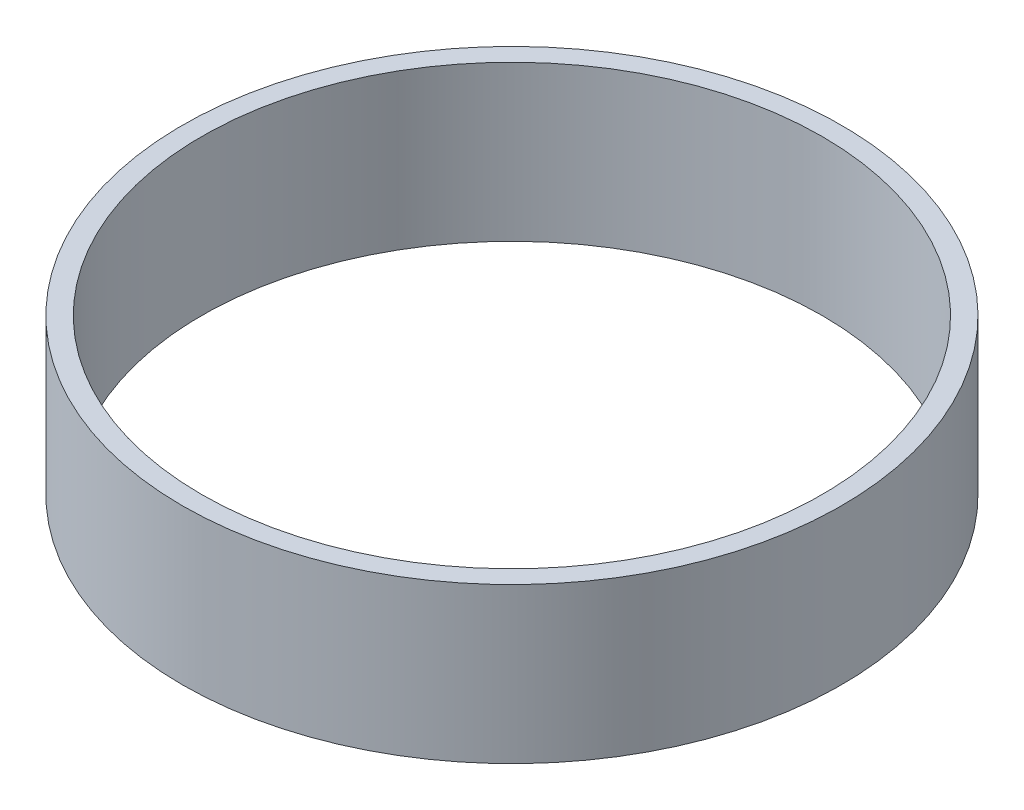
ISO-10303-21;
HEADER;
FILE_DESCRIPTION(('STEP AP214'),'2;1');
FILE_NAME('part.step','',(''),(''),'','','');
FILE_SCHEMA(('AUTOMOTIVE_DESIGN { 1 0 10303 214 1 1 1 1 }'));
ENDSEC;
DATA;
#1=APPLICATION_CONTEXT('core data for automotive mechanical design processes');
#2=APPLICATION_PROTOCOL_DEFINITION('international standard','automotive_design',2000,#1);
#3=PRODUCT_CONTEXT('',#1,'mechanical');
#4=PRODUCT('Part','Part','',(#3));
#5=PRODUCT_RELATED_PRODUCT_CATEGORY('part','',(#4));
#6=PRODUCT_DEFINITION_FORMATION('','',#4);
#7=PRODUCT_DEFINITION_CONTEXT('part definition',#1,'design');
#8=PRODUCT_DEFINITION('design','',#6,#7);
#9=PRODUCT_DEFINITION_SHAPE('','',#8);
#10=(LENGTH_UNIT() NAMED_UNIT(*) SI_UNIT(.MILLI.,.METRE.));
#11=(NAMED_UNIT(*) PLANE_ANGLE_UNIT() SI_UNIT($,.RADIAN.));
#12=(NAMED_UNIT(*) SI_UNIT($,.STERADIAN.) SOLID_ANGLE_UNIT());
#13=UNCERTAINTY_MEASURE_WITH_UNIT(LENGTH_MEASURE(1.E-05),#10,'distance_accuracy_value','');
#14=(GEOMETRIC_REPRESENTATION_CONTEXT(3) GLOBAL_UNCERTAINTY_ASSIGNED_CONTEXT((#13)) GLOBAL_UNIT_ASSIGNED_CONTEXT((#10,
#11,#12)) REPRESENTATION_CONTEXT('',''));
#15=CARTESIAN_POINT('',(0.,0.,0.));
#16=DIRECTION('',(0.,0.,1.));
#17=DIRECTION('',(1.,0.,0.));
#18=AXIS2_PLACEMENT_3D('',#15,#16,#17);
#19=CARTESIAN_POINT('',(0.,40.,0.));
#20=DIRECTION('',(0.,1.,0.));
#21=DIRECTION('',(0.,0.,1.));
#22=AXIS2_PLACEMENT_3D('',#19,#20,#21);
#23=PLANE('',#22);
#24=CARTESIAN_POINT('',(0.,40.,0.));
#25=DIRECTION('',(0.,1.,0.));
#26=DIRECTION('',(0.,0.,1.));
#27=AXIS2_PLACEMENT_3D('',#24,#25,#26);
#28=CIRCLE('',#27,85.);
#29=CARTESIAN_POINT('',(0.,40.,85.));
#30=VERTEX_POINT('',#29);
#31=EDGE_CURVE('E10',#30,#30,#28,.T.);
#32=ORIENTED_EDGE('',*,*,#31,.T.);
#33=EDGE_LOOP('',(#32));
#34=FACE_BOUND('',#33,.T.);
#35=CARTESIAN_POINT('',(0.,40.,0.));
#36=DIRECTION('',(0.,1.,0.));
#37=DIRECTION('',(0.,0.,1.));
#38=AXIS2_PLACEMENT_3D('',#35,#36,#37);
#39=CIRCLE('',#38,80.);
#40=CARTESIAN_POINT('',(0.,40.,80.));
#41=VERTEX_POINT('',#40);
#42=EDGE_CURVE('E42',#41,#41,#39,.T.);
#43=ORIENTED_EDGE('',*,*,#42,.F.);
#44=EDGE_LOOP('',(#43));
#45=FACE_BOUND('',#44,.T.);
#46=ADVANCED_FACE('F31',(#34,#45),#23,.T.);
#47=CARTESIAN_POINT('',(0.,0.,0.));
#48=DIRECTION('',(0.,1.,0.));
#49=DIRECTION('',(0.,0.,1.));
#50=AXIS2_PLACEMENT_3D('',#47,#48,#49);
#51=PLANE('',#50);
#52=CARTESIAN_POINT('',(0.,0.,0.));
#53=DIRECTION('',(0.,1.,0.));
#54=DIRECTION('',(0.,0.,1.));
#55=AXIS2_PLACEMENT_3D('',#52,#53,#54);
#56=CIRCLE('',#55,85.);
#57=CARTESIAN_POINT('',(0.,0.,85.));
#58=VERTEX_POINT('',#57);
#59=EDGE_CURVE('E35',#58,#58,#56,.T.);
#60=ORIENTED_EDGE('',*,*,#59,.F.);
#61=EDGE_LOOP('',(#60));
#62=FACE_BOUND('',#61,.T.);
#63=CARTESIAN_POINT('',(0.,0.,0.));
#64=DIRECTION('',(0.,1.,0.));
#65=DIRECTION('',(0.,0.,1.));
#66=AXIS2_PLACEMENT_3D('',#63,#64,#65);
#67=CIRCLE('',#66,80.);
#68=CARTESIAN_POINT('',(0.,0.,80.));
#69=VERTEX_POINT('',#68);
#70=EDGE_CURVE('E44',#69,#69,#67,.T.);
#71=ORIENTED_EDGE('',*,*,#70,.T.);
#72=EDGE_LOOP('',(#71));
#73=FACE_BOUND('',#72,.T.);
#74=ADVANCED_FACE('F54',(#62,#73),#51,.F.);
#75=CARTESIAN_POINT('',(0.,40.,0.));
#76=DIRECTION('',(0.,-1.,0.));
#77=DIRECTION('',(0.,0.,-1.));
#78=AXIS2_PLACEMENT_3D('',#75,#76,#77);
#79=CYLINDRICAL_SURFACE('',#78,85.);
#80=ORIENTED_EDGE('',*,*,#31,.F.);
#81=EDGE_LOOP('',(#80));
#82=FACE_BOUND('',#81,.T.);
#83=ORIENTED_EDGE('',*,*,#59,.T.);
#84=EDGE_LOOP('',(#83));
#85=FACE_BOUND('',#84,.T.);
#86=ADVANCED_FACE('F33',(#82,#85),#79,.T.);
#87=CARTESIAN_POINT('',(0.,40.,0.));
#88=DIRECTION('',(0.,-1.,0.));
#89=DIRECTION('',(0.,0.,-1.));
#90=AXIS2_PLACEMENT_3D('',#87,#88,#89);
#91=CYLINDRICAL_SURFACE('',#90,80.);
#92=ORIENTED_EDGE('',*,*,#42,.T.);
#93=EDGE_LOOP('',(#92));
#94=FACE_BOUND('',#93,.T.);
#95=ORIENTED_EDGE('',*,*,#70,.F.);
#96=EDGE_LOOP('',(#95));
#97=FACE_BOUND('',#96,.T.);
#98=ADVANCED_FACE('F50',(#94,#97),#91,.F.);
#99=CLOSED_SHELL('',(#46,#74,#86,#98));
#100=MANIFOLD_SOLID_BREP('B2',#99);
#101=ADVANCED_BREP_SHAPE_REPRESENTATION('',(#18,#100),#14);
#102=SHAPE_DEFINITION_REPRESENTATION(#9,#101);
ENDSEC;
END-ISO-10303-21;
